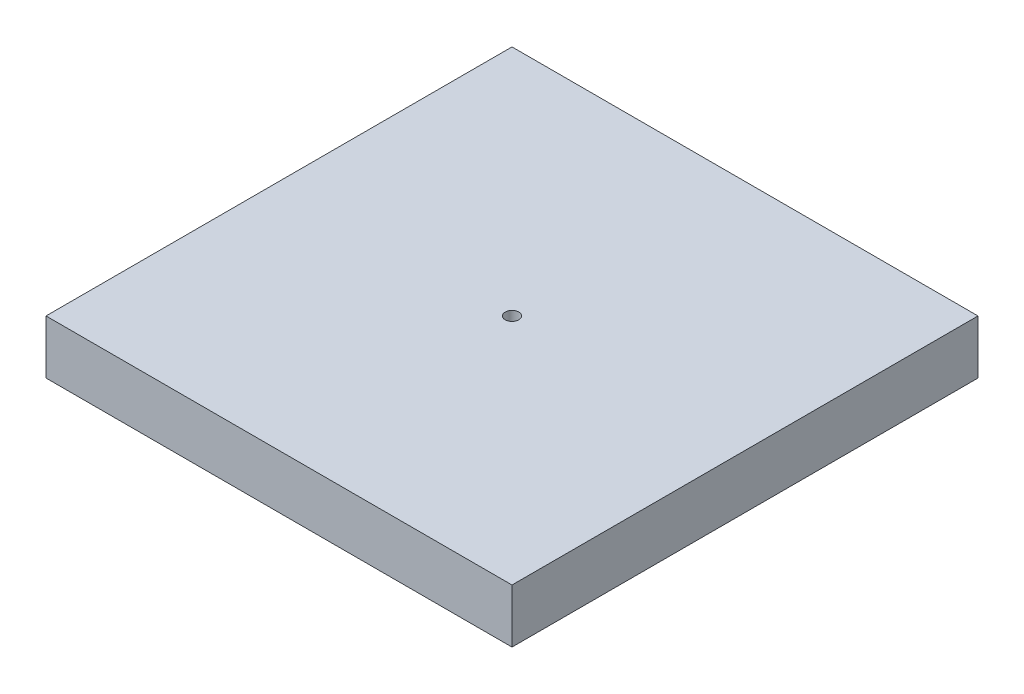
ISO-10303-21;
HEADER;
FILE_DESCRIPTION(('STEP AP214'),'2;1');
FILE_NAME('part.step','',(''),(''),'','','');
FILE_SCHEMA(('AUTOMOTIVE_DESIGN { 1 0 10303 214 1 1 1 1 }'));
ENDSEC;
DATA;
#1=APPLICATION_CONTEXT('core data for automotive mechanical design processes');
#2=APPLICATION_PROTOCOL_DEFINITION('international standard','automotive_design',2000,#1);
#3=PRODUCT_CONTEXT('',#1,'mechanical');
#4=PRODUCT('Part','Part','',(#3));
#5=PRODUCT_RELATED_PRODUCT_CATEGORY('part','',(#4));
#6=PRODUCT_DEFINITION_FORMATION('','',#4);
#7=PRODUCT_DEFINITION_CONTEXT('part definition',#1,'design');
#8=PRODUCT_DEFINITION('design','',#6,#7);
#9=PRODUCT_DEFINITION_SHAPE('','',#8);
#10=(LENGTH_UNIT() NAMED_UNIT(*) SI_UNIT(.MILLI.,.METRE.));
#11=(NAMED_UNIT(*) PLANE_ANGLE_UNIT() SI_UNIT($,.RADIAN.));
#12=(NAMED_UNIT(*) SI_UNIT($,.STERADIAN.) SOLID_ANGLE_UNIT());
#13=UNCERTAINTY_MEASURE_WITH_UNIT(LENGTH_MEASURE(1.E-05),#10,'distance_accuracy_value','');
#14=(GEOMETRIC_REPRESENTATION_CONTEXT(3) GLOBAL_UNCERTAINTY_ASSIGNED_CONTEXT((#13)) GLOBAL_UNIT_ASSIGNED_CONTEXT((#10,
#11,#12)) REPRESENTATION_CONTEXT('',''));
#15=CARTESIAN_POINT('',(0.,0.,0.));
#16=DIRECTION('',(0.,0.,1.));
#17=DIRECTION('',(1.,0.,0.));
#18=AXIS2_PLACEMENT_3D('',#15,#16,#17);
#19=CARTESIAN_POINT('',(-96.8059094610112,25.4,-95.4972945341705));
#20=DIRECTION('',(1.,0.,0.));
#21=DIRECTION('',(0.,0.,-1.));
#22=AXIS2_PLACEMENT_3D('',#19,#20,#21);
#23=PLANE('',#22);
#24=DIRECTION('',(0.,0.,1.));
#25=VECTOR('',#24,1.);
#26=CARTESIAN_POINT('',(-96.8059094610112,0.,-95.4972945341705));
#27=LINE('',#26,#25);
#28=CARTESIAN_POINT('',(-96.8059094610112,0.,-95.4972945341705));
#29=VERTEX_POINT('',#28);
#30=CARTESIAN_POINT('',(-96.8059094610112,0.,124.502705465829));
#31=VERTEX_POINT('',#30);
#32=EDGE_CURVE('E98',#29,#31,#27,.T.);
#33=ORIENTED_EDGE('',*,*,#32,.T.);
#34=DIRECTION('',(0.,-1.,0.));
#35=VECTOR('',#34,1.);
#36=CARTESIAN_POINT('',(-96.8059094610112,25.4,124.502705465829));
#37=LINE('',#36,#35);
#38=CARTESIAN_POINT('',(-96.8059094610112,25.4,124.502705465829));
#39=VERTEX_POINT('',#38);
#40=EDGE_CURVE('E11',#39,#31,#37,.T.);
#41=ORIENTED_EDGE('',*,*,#40,.F.);
#42=DIRECTION('',(0.,0.,1.));
#43=VECTOR('',#42,1.);
#44=CARTESIAN_POINT('',(-96.8059094610112,25.4,-95.4972945341705));
#45=LINE('',#44,#43);
#46=CARTESIAN_POINT('',(-96.8059094610112,25.4,-95.4972945341705));
#47=VERTEX_POINT('',#46);
#48=EDGE_CURVE('E86',#47,#39,#45,.T.);
#49=ORIENTED_EDGE('',*,*,#48,.F.);
#50=DIRECTION('',(0.,-1.,0.));
#51=VECTOR('',#50,1.);
#52=CARTESIAN_POINT('',(-96.8059094610112,25.4,-95.4972945341705));
#53=LINE('',#52,#51);
#54=EDGE_CURVE('E94',#47,#29,#53,.T.);
#55=ORIENTED_EDGE('',*,*,#54,.T.);
#56=EDGE_LOOP('',(#33,#41,#49,#55));
#57=FACE_BOUND('',#56,.T.);
#58=ADVANCED_FACE('F35',(#57),#23,.F.);
#59=CARTESIAN_POINT('',(-96.8059094610112,25.4,124.502705465829));
#60=DIRECTION('',(0.,0.,-1.));
#61=DIRECTION('',(-1.,0.,0.));
#62=AXIS2_PLACEMENT_3D('',#59,#60,#61);
#63=PLANE('',#62);
#64=DIRECTION('',(1.,0.,0.));
#65=VECTOR('',#64,1.);
#66=CARTESIAN_POINT('',(-96.8059094610112,0.,124.502705465829));
#67=LINE('',#66,#65);
#68=CARTESIAN_POINT('',(123.194090538989,0.,124.502705465829));
#69=VERTEX_POINT('',#68);
#70=EDGE_CURVE('E90',#31,#69,#67,.T.);
#71=ORIENTED_EDGE('',*,*,#70,.T.);
#72=DIRECTION('',(0.,-1.,0.));
#73=VECTOR('',#72,1.);
#74=CARTESIAN_POINT('',(123.194090538989,25.4,124.502705465829));
#75=LINE('',#74,#73);
#76=CARTESIAN_POINT('',(123.194090538989,25.4,124.502705465829));
#77=VERTEX_POINT('',#76);
#78=EDGE_CURVE('E43',#77,#69,#75,.T.);
#79=ORIENTED_EDGE('',*,*,#78,.F.);
#80=DIRECTION('',(1.,0.,0.));
#81=VECTOR('',#80,1.);
#82=CARTESIAN_POINT('',(-96.8059094610112,25.4,124.502705465829));
#83=LINE('',#82,#81);
#84=EDGE_CURVE('E81',#39,#77,#83,.T.);
#85=ORIENTED_EDGE('',*,*,#84,.F.);
#86=ORIENTED_EDGE('',*,*,#40,.T.);
#87=EDGE_LOOP('',(#71,#79,#85,#86));
#88=FACE_BOUND('',#87,.T.);
#89=ADVANCED_FACE('F89',(#88),#63,.F.);
#90=CARTESIAN_POINT('',(123.194090538989,25.4,-95.4972945341706));
#91=DIRECTION('',(-1.,0.,0.));
#92=DIRECTION('',(0.,0.,1.));
#93=AXIS2_PLACEMENT_3D('',#90,#91,#92);
#94=PLANE('',#93);
#95=DIRECTION('',(0.,0.,-1.));
#96=VECTOR('',#95,1.);
#97=CARTESIAN_POINT('',(123.194090538989,0.,-95.4972945341706));
#98=LINE('',#97,#96);
#99=CARTESIAN_POINT('',(123.194090538989,0.,-95.4972945341706));
#100=VERTEX_POINT('',#99);
#101=EDGE_CURVE('E68',#69,#100,#98,.T.);
#102=ORIENTED_EDGE('',*,*,#101,.T.);
#103=DIRECTION('',(0.,-1.,0.));
#104=VECTOR('',#103,1.);
#105=CARTESIAN_POINT('',(123.194090538989,25.4,-95.4972945341706));
#106=LINE('',#105,#104);
#107=CARTESIAN_POINT('',(123.194090538989,25.4,-95.4972945341706));
#108=VERTEX_POINT('',#107);
#109=EDGE_CURVE('E91',#108,#100,#106,.T.);
#110=ORIENTED_EDGE('',*,*,#109,.F.);
#111=DIRECTION('',(0.,0.,-1.));
#112=VECTOR('',#111,1.);
#113=CARTESIAN_POINT('',(123.194090538989,25.4,-95.4972945341706));
#114=LINE('',#113,#112);
#115=EDGE_CURVE('E84',#77,#108,#114,.T.);
#116=ORIENTED_EDGE('',*,*,#115,.F.);
#117=ORIENTED_EDGE('',*,*,#78,.T.);
#118=EDGE_LOOP('',(#102,#110,#116,#117));
#119=FACE_BOUND('',#118,.T.);
#120=ADVANCED_FACE('F92',(#119),#94,.F.);
#121=CARTESIAN_POINT('',(-96.8059094610112,25.4,-95.4972945341705));
#122=DIRECTION('',(0.,0.,1.));
#123=DIRECTION('',(1.,0.,0.));
#124=AXIS2_PLACEMENT_3D('',#121,#122,#123);
#125=PLANE('',#124);
#126=DIRECTION('',(-1.,0.,0.));
#127=VECTOR('',#126,1.);
#128=CARTESIAN_POINT('',(-96.8059094610112,0.,-95.4972945341705));
#129=LINE('',#128,#127);
#130=EDGE_CURVE('E74',#100,#29,#129,.T.);
#131=ORIENTED_EDGE('',*,*,#130,.T.);
#132=ORIENTED_EDGE('',*,*,#54,.F.);
#133=DIRECTION('',(-1.,0.,0.));
#134=VECTOR('',#133,1.);
#135=CARTESIAN_POINT('',(-96.8059094610112,25.4,-95.4972945341705));
#136=LINE('',#135,#134);
#137=EDGE_CURVE('E51',#108,#47,#136,.T.);
#138=ORIENTED_EDGE('',*,*,#137,.F.);
#139=ORIENTED_EDGE('',*,*,#109,.T.);
#140=EDGE_LOOP('',(#131,#132,#138,#139));
#141=FACE_BOUND('',#140,.T.);
#142=ADVANCED_FACE('F106',(#141),#125,.F.);
#143=CARTESIAN_POINT('',(0.,25.4,0.));
#144=DIRECTION('',(0.,1.,0.));
#145=DIRECTION('',(0.,0.,1.));
#146=AXIS2_PLACEMENT_3D('',#143,#144,#145);
#147=PLANE('',#146);
#148=CARTESIAN_POINT('',(13.1940905389888,25.4,14.5027054658294));
#149=DIRECTION('',(0.,1.,0.));
#150=DIRECTION('',(0.,0.,1.));
#151=AXIS2_PLACEMENT_3D('',#148,#149,#150);
#152=CIRCLE('',#151,3.2);
#153=CARTESIAN_POINT('',(13.1940905389888,25.4,17.7027054658294));
#154=VERTEX_POINT('',#153);
#155=EDGE_CURVE('E112',#154,#154,#152,.T.);
#156=ORIENTED_EDGE('',*,*,#155,.F.);
#157=EDGE_LOOP('',(#156));
#158=FACE_BOUND('',#157,.T.);
#159=ORIENTED_EDGE('',*,*,#48,.T.);
#160=ORIENTED_EDGE('',*,*,#84,.T.);
#161=ORIENTED_EDGE('',*,*,#115,.T.);
#162=ORIENTED_EDGE('',*,*,#137,.T.);
#163=EDGE_LOOP('',(#159,#160,#161,#162));
#164=FACE_BOUND('',#163,.T.);
#165=ADVANCED_FACE('F82',(#158,#164),#147,.T.);
#166=CARTESIAN_POINT('',(0.,0.,0.));
#167=DIRECTION('',(0.,1.,0.));
#168=DIRECTION('',(0.,0.,1.));
#169=AXIS2_PLACEMENT_3D('',#166,#167,#168);
#170=PLANE('',#169);
#171=CARTESIAN_POINT('',(13.1940905389888,0.,14.5027054658294));
#172=DIRECTION('',(0.,1.,0.));
#173=DIRECTION('',(0.,0.,1.));
#174=AXIS2_PLACEMENT_3D('',#171,#172,#173);
#175=CIRCLE('',#174,3.2);
#176=CARTESIAN_POINT('',(13.1940905389888,0.,17.7027054658294));
#177=VERTEX_POINT('',#176);
#178=EDGE_CURVE('E101',#177,#177,#175,.T.);
#179=ORIENTED_EDGE('',*,*,#178,.T.);
#180=EDGE_LOOP('',(#179));
#181=FACE_BOUND('',#180,.T.);
#182=ORIENTED_EDGE('',*,*,#32,.F.);
#183=ORIENTED_EDGE('',*,*,#130,.F.);
#184=ORIENTED_EDGE('',*,*,#101,.F.);
#185=ORIENTED_EDGE('',*,*,#70,.F.);
#186=EDGE_LOOP('',(#182,#183,#184,#185));
#187=FACE_BOUND('',#186,.T.);
#188=ADVANCED_FACE('F109',(#181,#187),#170,.F.);
#189=CARTESIAN_POINT('',(13.1940905389888,0.,14.5027054658294));
#190=DIRECTION('',(0.,1.,0.));
#191=DIRECTION('',(0.,0.,1.));
#192=AXIS2_PLACEMENT_3D('',#189,#190,#191);
#193=CYLINDRICAL_SURFACE('',#192,3.2);
#194=ORIENTED_EDGE('',*,*,#178,.F.);
#195=EDGE_LOOP('',(#194));
#196=FACE_BOUND('',#195,.T.);
#197=ORIENTED_EDGE('',*,*,#155,.T.);
#198=EDGE_LOOP('',(#197));
#199=FACE_BOUND('',#198,.T.);
#200=ADVANCED_FACE('F119',(#196,#199),#193,.F.);
#201=CLOSED_SHELL('',(#58,#89,#120,#142,#165,#188,#200));
#202=MANIFOLD_SOLID_BREP('B2',#201);
#203=ADVANCED_BREP_SHAPE_REPRESENTATION('',(#18,#202),#14);
#204=SHAPE_DEFINITION_REPRESENTATION(#9,#203);
ENDSEC;
END-ISO-10303-21;
